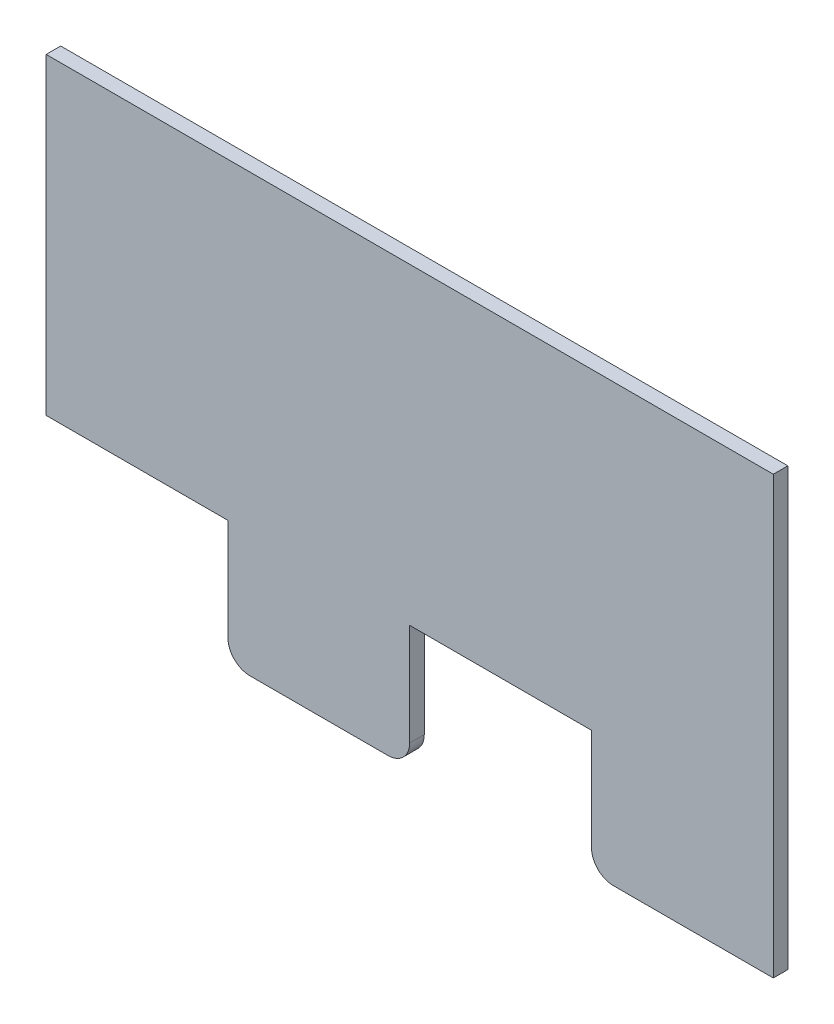
ISO-10303-21;
HEADER;
FILE_DESCRIPTION(('STEP AP214'),'2;1');
FILE_NAME('part.step','',(''),(''),'','','');
FILE_SCHEMA(('AUTOMOTIVE_DESIGN { 1 0 10303 214 1 1 1 1 }'));
ENDSEC;
DATA;
#1=APPLICATION_CONTEXT('core data for automotive mechanical design processes');
#2=APPLICATION_PROTOCOL_DEFINITION('international standard','automotive_design',2000,#1);
#3=PRODUCT_CONTEXT('',#1,'mechanical');
#4=PRODUCT('Part','Part','',(#3));
#5=PRODUCT_RELATED_PRODUCT_CATEGORY('part','',(#4));
#6=PRODUCT_DEFINITION_FORMATION('','',#4);
#7=PRODUCT_DEFINITION_CONTEXT('part definition',#1,'design');
#8=PRODUCT_DEFINITION('design','',#6,#7);
#9=PRODUCT_DEFINITION_SHAPE('','',#8);
#10=(LENGTH_UNIT() NAMED_UNIT(*) SI_UNIT(.MILLI.,.METRE.));
#11=(NAMED_UNIT(*) PLANE_ANGLE_UNIT() SI_UNIT($,.RADIAN.));
#12=(NAMED_UNIT(*) SI_UNIT($,.STERADIAN.) SOLID_ANGLE_UNIT());
#13=UNCERTAINTY_MEASURE_WITH_UNIT(LENGTH_MEASURE(1.E-05),#10,'distance_accuracy_value','');
#14=(GEOMETRIC_REPRESENTATION_CONTEXT(3) GLOBAL_UNCERTAINTY_ASSIGNED_CONTEXT((#13)) GLOBAL_UNIT_ASSIGNED_CONTEXT((#10,
#11,#12)) REPRESENTATION_CONTEXT('',''));
#15=CARTESIAN_POINT('',(0.,0.,0.));
#16=DIRECTION('',(0.,0.,1.));
#17=DIRECTION('',(1.,0.,0.));
#18=AXIS2_PLACEMENT_3D('',#15,#16,#17);
#19=CARTESIAN_POINT('',(28.,-17.,2.));
#20=DIRECTION('',(0.,0.,-1.));
#21=DIRECTION('',(-1.,0.,0.));
#22=AXIS2_PLACEMENT_3D('',#19,#20,#21);
#23=CYLINDRICAL_SURFACE('',#22,3.);
#24=CARTESIAN_POINT('',(28.,-17.,0.));
#25=DIRECTION('',(0.,0.,1.));
#26=DIRECTION('',(1.,0.,0.));
#27=AXIS2_PLACEMENT_3D('',#24,#25,#26);
#28=CIRCLE('',#27,3.);
#29=CARTESIAN_POINT('',(28.,-20.,0.));
#30=VERTEX_POINT('',#29);
#31=CARTESIAN_POINT('',(25.,-17.,0.));
#32=VERTEX_POINT('',#31);
#33=EDGE_CURVE('E160',#30,#32,#28,.F.);
#34=ORIENTED_EDGE('',*,*,#33,.F.);
#35=DIRECTION('',(0.,0.,-1.));
#36=VECTOR('',#35,1.);
#37=CARTESIAN_POINT('',(28.,-20.,2.));
#38=LINE('',#37,#36);
#39=CARTESIAN_POINT('',(28.,-20.,2.));
#40=VERTEX_POINT('',#39);
#41=EDGE_CURVE('E11',#40,#30,#38,.T.);
#42=ORIENTED_EDGE('',*,*,#41,.F.);
#43=CARTESIAN_POINT('',(28.,-17.,2.));
#44=DIRECTION('',(0.,0.,1.));
#45=DIRECTION('',(1.,0.,0.));
#46=AXIS2_PLACEMENT_3D('',#43,#44,#45);
#47=CIRCLE('',#46,3.);
#48=CARTESIAN_POINT('',(25.,-17.,2.));
#49=VERTEX_POINT('',#48);
#50=EDGE_CURVE('E190',#40,#49,#47,.F.);
#51=ORIENTED_EDGE('',*,*,#50,.T.);
#52=DIRECTION('',(0.,0.,-1.));
#53=VECTOR('',#52,1.);
#54=CARTESIAN_POINT('',(25.,-17.,2.));
#55=LINE('',#54,#53);
#56=EDGE_CURVE('E101',#49,#32,#55,.T.);
#57=ORIENTED_EDGE('',*,*,#56,.T.);
#58=EDGE_LOOP('',(#34,#42,#51,#57));
#59=FACE_BOUND('',#58,.T.);
#60=ADVANCED_FACE('F36',(#59),#23,.T.);
#61=CARTESIAN_POINT('',(0.,-20.,2.));
#62=DIRECTION('',(0.,1.,0.));
#63=DIRECTION('',(-1.,0.,0.));
#64=AXIS2_PLACEMENT_3D('',#61,#62,#63);
#65=PLANE('',#64);
#66=DIRECTION('',(1.,0.,0.));
#67=VECTOR('',#66,1.);
#68=CARTESIAN_POINT('',(0.,-20.,0.));
#69=LINE('',#68,#67);
#70=CARTESIAN_POINT('',(50.,-20.,0.));
#71=VERTEX_POINT('',#70);
#72=EDGE_CURVE('E163',#30,#71,#69,.T.);
#73=ORIENTED_EDGE('',*,*,#72,.T.);
#74=DIRECTION('',(0.,0.,-1.));
#75=VECTOR('',#74,1.);
#76=CARTESIAN_POINT('',(50.,-20.,2.));
#77=LINE('',#76,#75);
#78=CARTESIAN_POINT('',(50.,-20.,2.));
#79=VERTEX_POINT('',#78);
#80=EDGE_CURVE('E44',#79,#71,#77,.T.);
#81=ORIENTED_EDGE('',*,*,#80,.F.);
#82=DIRECTION('',(1.,0.,0.));
#83=VECTOR('',#82,1.);
#84=CARTESIAN_POINT('',(0.,-20.,2.));
#85=LINE('',#84,#83);
#86=EDGE_CURVE('E236',#40,#79,#85,.T.);
#87=ORIENTED_EDGE('',*,*,#86,.F.);
#88=ORIENTED_EDGE('',*,*,#41,.T.);
#89=EDGE_LOOP('',(#73,#81,#87,#88));
#90=FACE_BOUND('',#89,.T.);
#91=ADVANCED_FACE('F258',(#90),#65,.F.);
#92=CARTESIAN_POINT('',(50.,0.,2.));
#93=DIRECTION('',(-1.,0.,0.));
#94=DIRECTION('',(0.,0.,1.));
#95=AXIS2_PLACEMENT_3D('',#92,#93,#94);
#96=PLANE('',#95);
#97=DIRECTION('',(0.,1.,0.));
#98=VECTOR('',#97,1.);
#99=CARTESIAN_POINT('',(50.,0.,0.));
#100=LINE('',#99,#98);
#101=CARTESIAN_POINT('',(50.,40.,0.));
#102=VERTEX_POINT('',#101);
#103=EDGE_CURVE('E165',#71,#102,#100,.T.);
#104=ORIENTED_EDGE('',*,*,#103,.T.);
#105=DIRECTION('',(0.,0.,-1.));
#106=VECTOR('',#105,1.);
#107=CARTESIAN_POINT('',(50.,40.,2.));
#108=LINE('',#107,#106);
#109=CARTESIAN_POINT('',(50.,40.,2.));
#110=VERTEX_POINT('',#109);
#111=EDGE_CURVE('E209',#110,#102,#108,.T.);
#112=ORIENTED_EDGE('',*,*,#111,.F.);
#113=DIRECTION('',(0.,1.,0.));
#114=VECTOR('',#113,1.);
#115=CARTESIAN_POINT('',(50.,0.,2.));
#116=LINE('',#115,#114);
#117=EDGE_CURVE('E217',#79,#110,#116,.T.);
#118=ORIENTED_EDGE('',*,*,#117,.F.);
#119=ORIENTED_EDGE('',*,*,#80,.T.);
#120=EDGE_LOOP('',(#104,#112,#118,#119));
#121=FACE_BOUND('',#120,.T.);
#122=ADVANCED_FACE('F215',(#121),#96,.F.);
#123=CARTESIAN_POINT('',(0.,40.,2.));
#124=DIRECTION('',(0.,1.,0.));
#125=DIRECTION('',(0.,0.,1.));
#126=AXIS2_PLACEMENT_3D('',#123,#124,#125);
#127=PLANE('',#126);
#128=DIRECTION('',(1.,0.,0.));
#129=VECTOR('',#128,1.);
#130=CARTESIAN_POINT('',(0.,40.,0.));
#131=LINE('',#130,#129);
#132=CARTESIAN_POINT('',(-50.,40.,0.));
#133=VERTEX_POINT('',#132);
#134=EDGE_CURVE('E168',#133,#102,#131,.T.);
#135=ORIENTED_EDGE('',*,*,#134,.F.);
#136=DIRECTION('',(0.,0.,-1.));
#137=VECTOR('',#136,1.);
#138=CARTESIAN_POINT('',(-50.,40.,2.));
#139=LINE('',#138,#137);
#140=CARTESIAN_POINT('',(-50.,40.,2.));
#141=VERTEX_POINT('',#140);
#142=EDGE_CURVE('E207',#141,#133,#139,.T.);
#143=ORIENTED_EDGE('',*,*,#142,.F.);
#144=DIRECTION('',(1.,0.,0.));
#145=VECTOR('',#144,1.);
#146=CARTESIAN_POINT('',(0.,40.,2.));
#147=LINE('',#146,#145);
#148=EDGE_CURVE('E229',#141,#110,#147,.T.);
#149=ORIENTED_EDGE('',*,*,#148,.T.);
#150=ORIENTED_EDGE('',*,*,#111,.T.);
#151=EDGE_LOOP('',(#135,#143,#149,#150));
#152=FACE_BOUND('',#151,.T.);
#153=ADVANCED_FACE('F226',(#152),#127,.T.);
#154=CARTESIAN_POINT('',(-50.,0.,2.));
#155=DIRECTION('',(-1.,0.,0.));
#156=DIRECTION('',(0.,0.,1.));
#157=AXIS2_PLACEMENT_3D('',#154,#155,#156);
#158=PLANE('',#157);
#159=DIRECTION('',(0.,1.,0.));
#160=VECTOR('',#159,1.);
#161=CARTESIAN_POINT('',(-50.,0.,0.));
#162=LINE('',#161,#160);
#163=CARTESIAN_POINT('',(-50.,-3.,0.));
#164=VERTEX_POINT('',#163);
#165=EDGE_CURVE('E171',#164,#133,#162,.T.);
#166=ORIENTED_EDGE('',*,*,#165,.F.);
#167=DIRECTION('',(0.,0.,-1.));
#168=VECTOR('',#167,1.);
#169=CARTESIAN_POINT('',(-50.,-3.,2.));
#170=LINE('',#169,#168);
#171=CARTESIAN_POINT('',(-50.,-3.,2.));
#172=VERTEX_POINT('',#171);
#173=EDGE_CURVE('E205',#172,#164,#170,.T.);
#174=ORIENTED_EDGE('',*,*,#173,.F.);
#175=DIRECTION('',(0.,1.,0.));
#176=VECTOR('',#175,1.);
#177=CARTESIAN_POINT('',(-50.,0.,2.));
#178=LINE('',#177,#176);
#179=EDGE_CURVE('E232',#172,#141,#178,.T.);
#180=ORIENTED_EDGE('',*,*,#179,.T.);
#181=ORIENTED_EDGE('',*,*,#142,.T.);
#182=EDGE_LOOP('',(#166,#174,#180,#181));
#183=FACE_BOUND('',#182,.T.);
#184=ADVANCED_FACE('F268',(#183),#158,.T.);
#185=CARTESIAN_POINT('',(0.,-3.,2.));
#186=DIRECTION('',(0.,1.,0.));
#187=DIRECTION('',(0.,0.,1.));
#188=AXIS2_PLACEMENT_3D('',#185,#186,#187);
#189=PLANE('',#188);
#190=DIRECTION('',(1.,0.,0.));
#191=VECTOR('',#190,1.);
#192=CARTESIAN_POINT('',(0.,-3.,0.));
#193=LINE('',#192,#191);
#194=CARTESIAN_POINT('',(-25.,-3.,0.));
#195=VERTEX_POINT('',#194);
#196=EDGE_CURVE('E174',#164,#195,#193,.T.);
#197=ORIENTED_EDGE('',*,*,#196,.T.);
#198=DIRECTION('',(0.,0.,-1.));
#199=VECTOR('',#198,1.);
#200=CARTESIAN_POINT('',(-25.,-3.,2.));
#201=LINE('',#200,#199);
#202=CARTESIAN_POINT('',(-25.,-3.,2.));
#203=VERTEX_POINT('',#202);
#204=EDGE_CURVE('E202',#203,#195,#201,.T.);
#205=ORIENTED_EDGE('',*,*,#204,.F.);
#206=DIRECTION('',(1.,0.,0.));
#207=VECTOR('',#206,1.);
#208=CARTESIAN_POINT('',(0.,-3.,2.));
#209=LINE('',#208,#207);
#210=EDGE_CURVE('E234',#172,#203,#209,.T.);
#211=ORIENTED_EDGE('',*,*,#210,.F.);
#212=ORIENTED_EDGE('',*,*,#173,.T.);
#213=EDGE_LOOP('',(#197,#205,#211,#212));
#214=FACE_BOUND('',#213,.T.);
#215=ADVANCED_FACE('F271',(#214),#189,.F.);
#216=CARTESIAN_POINT('',(-25.,0.,2.));
#217=DIRECTION('',(1.,0.,0.));
#218=DIRECTION('',(0.,1.,0.));
#219=AXIS2_PLACEMENT_3D('',#216,#217,#218);
#220=PLANE('',#219);
#221=DIRECTION('',(0.,-1.,0.));
#222=VECTOR('',#221,1.);
#223=CARTESIAN_POINT('',(-25.,0.,0.));
#224=LINE('',#223,#222);
#225=CARTESIAN_POINT('',(-25.,-17.,0.));
#226=VERTEX_POINT('',#225);
#227=EDGE_CURVE('E176',#195,#226,#224,.T.);
#228=ORIENTED_EDGE('',*,*,#227,.T.);
#229=DIRECTION('',(0.,0.,-1.));
#230=VECTOR('',#229,1.);
#231=CARTESIAN_POINT('',(-25.,-17.,2.));
#232=LINE('',#231,#230);
#233=CARTESIAN_POINT('',(-25.,-17.,2.));
#234=VERTEX_POINT('',#233);
#235=EDGE_CURVE('E199',#234,#226,#232,.T.);
#236=ORIENTED_EDGE('',*,*,#235,.F.);
#237=DIRECTION('',(0.,-1.,0.));
#238=VECTOR('',#237,1.);
#239=CARTESIAN_POINT('',(-25.,0.,2.));
#240=LINE('',#239,#238);
#241=EDGE_CURVE('E241',#203,#234,#240,.T.);
#242=ORIENTED_EDGE('',*,*,#241,.F.);
#243=ORIENTED_EDGE('',*,*,#204,.T.);
#244=EDGE_LOOP('',(#228,#236,#242,#243));
#245=FACE_BOUND('',#244,.T.);
#246=ADVANCED_FACE('F275',(#245),#220,.F.);
#247=CARTESIAN_POINT('',(-22.,-17.,2.));
#248=DIRECTION('',(0.,0.,-1.));
#249=DIRECTION('',(-1.,0.,0.));
#250=AXIS2_PLACEMENT_3D('',#247,#248,#249);
#251=CYLINDRICAL_SURFACE('',#250,3.);
#252=CARTESIAN_POINT('',(-22.,-17.,0.));
#253=DIRECTION('',(0.,0.,1.));
#254=DIRECTION('',(1.,0.,0.));
#255=AXIS2_PLACEMENT_3D('',#252,#253,#254);
#256=CIRCLE('',#255,3.);
#257=CARTESIAN_POINT('',(-22.,-20.,0.));
#258=VERTEX_POINT('',#257);
#259=EDGE_CURVE('E178',#226,#258,#256,.T.);
#260=ORIENTED_EDGE('',*,*,#259,.T.);
#261=DIRECTION('',(0.,0.,-1.));
#262=VECTOR('',#261,1.);
#263=CARTESIAN_POINT('',(-22.,-20.,2.));
#264=LINE('',#263,#262);
#265=CARTESIAN_POINT('',(-22.,-20.,2.));
#266=VERTEX_POINT('',#265);
#267=EDGE_CURVE('E196',#266,#258,#264,.T.);
#268=ORIENTED_EDGE('',*,*,#267,.F.);
#269=CARTESIAN_POINT('',(-22.,-17.,2.));
#270=DIRECTION('',(0.,0.,1.));
#271=DIRECTION('',(1.,0.,0.));
#272=AXIS2_PLACEMENT_3D('',#269,#270,#271);
#273=CIRCLE('',#272,3.);
#274=EDGE_CURVE('E243',#234,#266,#273,.T.);
#275=ORIENTED_EDGE('',*,*,#274,.F.);
#276=ORIENTED_EDGE('',*,*,#235,.T.);
#277=EDGE_LOOP('',(#260,#268,#275,#276));
#278=FACE_BOUND('',#277,.T.);
#279=ADVANCED_FACE('F279',(#278),#251,.T.);
#280=CARTESIAN_POINT('',(0.,-20.,2.));
#281=DIRECTION('',(0.,1.,0.));
#282=DIRECTION('',(0.,0.,1.));
#283=AXIS2_PLACEMENT_3D('',#280,#281,#282);
#284=PLANE('',#283);
#285=DIRECTION('',(1.,0.,0.));
#286=VECTOR('',#285,1.);
#287=CARTESIAN_POINT('',(0.,-20.,0.));
#288=LINE('',#287,#286);
#289=CARTESIAN_POINT('',(-3.00000000000001,-20.,0.));
#290=VERTEX_POINT('',#289);
#291=EDGE_CURVE('E180',#258,#290,#288,.T.);
#292=ORIENTED_EDGE('',*,*,#291,.T.);
#293=DIRECTION('',(0.,0.,-1.));
#294=VECTOR('',#293,1.);
#295=CARTESIAN_POINT('',(-3.00000000000001,-20.,2.));
#296=LINE('',#295,#294);
#297=CARTESIAN_POINT('',(-3.00000000000001,-20.,2.));
#298=VERTEX_POINT('',#297);
#299=EDGE_CURVE('E194',#298,#290,#296,.T.);
#300=ORIENTED_EDGE('',*,*,#299,.F.);
#301=DIRECTION('',(1.,0.,0.));
#302=VECTOR('',#301,1.);
#303=CARTESIAN_POINT('',(0.,-20.,2.));
#304=LINE('',#303,#302);
#305=EDGE_CURVE('E155',#266,#298,#304,.T.);
#306=ORIENTED_EDGE('',*,*,#305,.F.);
#307=ORIENTED_EDGE('',*,*,#267,.T.);
#308=EDGE_LOOP('',(#292,#300,#306,#307));
#309=FACE_BOUND('',#308,.T.);
#310=ADVANCED_FACE('F249',(#309),#284,.F.);
#311=CARTESIAN_POINT('',(-2.99999999999999,-17.,2.));
#312=DIRECTION('',(0.,0.,-1.));
#313=DIRECTION('',(-1.,0.,0.));
#314=AXIS2_PLACEMENT_3D('',#311,#312,#313);
#315=CYLINDRICAL_SURFACE('',#314,3.);
#316=CARTESIAN_POINT('',(-2.99999999999999,-17.,0.));
#317=DIRECTION('',(0.,0.,1.));
#318=DIRECTION('',(1.,0.,0.));
#319=AXIS2_PLACEMENT_3D('',#316,#317,#318);
#320=CIRCLE('',#319,3.);
#321=CARTESIAN_POINT('',(0.,-17.,0.));
#322=VERTEX_POINT('',#321);
#323=EDGE_CURVE('E183',#322,#290,#320,.F.);
#324=ORIENTED_EDGE('',*,*,#323,.F.);
#325=DIRECTION('',(0.,0.,-1.));
#326=VECTOR('',#325,1.);
#327=CARTESIAN_POINT('',(0.,-17.,2.));
#328=LINE('',#327,#326);
#329=CARTESIAN_POINT('',(0.,-17.,2.));
#330=VERTEX_POINT('',#329);
#331=EDGE_CURVE('E144',#330,#322,#328,.T.);
#332=ORIENTED_EDGE('',*,*,#331,.F.);
#333=CARTESIAN_POINT('',(-2.99999999999999,-17.,2.));
#334=DIRECTION('',(0.,0.,1.));
#335=DIRECTION('',(1.,0.,0.));
#336=AXIS2_PLACEMENT_3D('',#333,#334,#335);
#337=CIRCLE('',#336,3.);
#338=EDGE_CURVE('E153',#330,#298,#337,.F.);
#339=ORIENTED_EDGE('',*,*,#338,.T.);
#340=ORIENTED_EDGE('',*,*,#299,.T.);
#341=EDGE_LOOP('',(#324,#332,#339,#340));
#342=FACE_BOUND('',#341,.T.);
#343=ADVANCED_FACE('F253',(#342),#315,.T.);
#344=CARTESIAN_POINT('',(0.,0.,2.));
#345=DIRECTION('',(1.,0.,0.));
#346=DIRECTION('',(0.,0.,-1.));
#347=AXIS2_PLACEMENT_3D('',#344,#345,#346);
#348=PLANE('',#347);
#349=DIRECTION('',(0.,-1.,0.));
#350=VECTOR('',#349,1.);
#351=CARTESIAN_POINT('',(0.,0.,0.));
#352=LINE('',#351,#350);
#353=CARTESIAN_POINT('',(0.,-3.,0.));
#354=VERTEX_POINT('',#353);
#355=EDGE_CURVE('E143',#354,#322,#352,.T.);
#356=ORIENTED_EDGE('',*,*,#355,.F.);
#357=DIRECTION('',(0.,0.,-1.));
#358=VECTOR('',#357,1.);
#359=CARTESIAN_POINT('',(0.,-3.,2.));
#360=LINE('',#359,#358);
#361=CARTESIAN_POINT('',(0.,-3.,2.));
#362=VERTEX_POINT('',#361);
#363=EDGE_CURVE('E137',#362,#354,#360,.T.);
#364=ORIENTED_EDGE('',*,*,#363,.F.);
#365=DIRECTION('',(0.,-1.,0.));
#366=VECTOR('',#365,1.);
#367=CARTESIAN_POINT('',(0.,0.,2.));
#368=LINE('',#367,#366);
#369=EDGE_CURVE('E141',#362,#330,#368,.T.);
#370=ORIENTED_EDGE('',*,*,#369,.T.);
#371=ORIENTED_EDGE('',*,*,#331,.T.);
#372=EDGE_LOOP('',(#356,#364,#370,#371));
#373=FACE_BOUND('',#372,.T.);
#374=ADVANCED_FACE('F139',(#373),#348,.T.);
#375=CARTESIAN_POINT('',(0.,-3.,2.));
#376=DIRECTION('',(0.,1.,0.));
#377=DIRECTION('',(0.,0.,1.));
#378=AXIS2_PLACEMENT_3D('',#375,#376,#377);
#379=PLANE('',#378);
#380=DIRECTION('',(1.,0.,0.));
#381=VECTOR('',#380,1.);
#382=CARTESIAN_POINT('',(0.,-3.,0.));
#383=LINE('',#382,#381);
#384=CARTESIAN_POINT('',(25.,-3.,0.));
#385=VERTEX_POINT('',#384);
#386=EDGE_CURVE('E94',#354,#385,#383,.T.);
#387=ORIENTED_EDGE('',*,*,#386,.T.);
#388=DIRECTION('',(0.,0.,-1.));
#389=VECTOR('',#388,1.);
#390=CARTESIAN_POINT('',(25.,-3.,2.));
#391=LINE('',#390,#389);
#392=CARTESIAN_POINT('',(25.,-3.,2.));
#393=VERTEX_POINT('',#392);
#394=EDGE_CURVE('E145',#393,#385,#391,.T.);
#395=ORIENTED_EDGE('',*,*,#394,.F.);
#396=DIRECTION('',(1.,0.,0.));
#397=VECTOR('',#396,1.);
#398=CARTESIAN_POINT('',(0.,-3.,2.));
#399=LINE('',#398,#397);
#400=EDGE_CURVE('E147',#362,#393,#399,.T.);
#401=ORIENTED_EDGE('',*,*,#400,.F.);
#402=ORIENTED_EDGE('',*,*,#363,.T.);
#403=EDGE_LOOP('',(#387,#395,#401,#402));
#404=FACE_BOUND('',#403,.T.);
#405=ADVANCED_FACE('F148',(#404),#379,.F.);
#406=CARTESIAN_POINT('',(25.,0.,2.));
#407=DIRECTION('',(1.,0.,0.));
#408=DIRECTION('',(0.,0.,-1.));
#409=AXIS2_PLACEMENT_3D('',#406,#407,#408);
#410=PLANE('',#409);
#411=DIRECTION('',(0.,-1.,0.));
#412=VECTOR('',#411,1.);
#413=CARTESIAN_POINT('',(25.,0.,0.));
#414=LINE('',#413,#412);
#415=EDGE_CURVE('E188',#385,#32,#414,.T.);
#416=ORIENTED_EDGE('',*,*,#415,.T.);
#417=ORIENTED_EDGE('',*,*,#56,.F.);
#418=DIRECTION('',(0.,-1.,0.));
#419=VECTOR('',#418,1.);
#420=CARTESIAN_POINT('',(25.,0.,2.));
#421=LINE('',#420,#419);
#422=EDGE_CURVE('E52',#393,#49,#421,.T.);
#423=ORIENTED_EDGE('',*,*,#422,.F.);
#424=ORIENTED_EDGE('',*,*,#394,.T.);
#425=EDGE_LOOP('',(#416,#417,#423,#424));
#426=FACE_BOUND('',#425,.T.);
#427=ADVANCED_FACE('F256',(#426),#410,.F.);
#428=CARTESIAN_POINT('',(0.,0.,2.));
#429=DIRECTION('',(0.,0.,1.));
#430=DIRECTION('',(1.,0.,0.));
#431=AXIS2_PLACEMENT_3D('',#428,#429,#430);
#432=PLANE('',#431);
#433=ORIENTED_EDGE('',*,*,#50,.F.);
#434=ORIENTED_EDGE('',*,*,#86,.T.);
#435=ORIENTED_EDGE('',*,*,#117,.T.);
#436=ORIENTED_EDGE('',*,*,#148,.F.);
#437=ORIENTED_EDGE('',*,*,#179,.F.);
#438=ORIENTED_EDGE('',*,*,#210,.T.);
#439=ORIENTED_EDGE('',*,*,#241,.T.);
#440=ORIENTED_EDGE('',*,*,#274,.T.);
#441=ORIENTED_EDGE('',*,*,#305,.T.);
#442=ORIENTED_EDGE('',*,*,#338,.F.);
#443=ORIENTED_EDGE('',*,*,#369,.F.);
#444=ORIENTED_EDGE('',*,*,#400,.T.);
#445=ORIENTED_EDGE('',*,*,#422,.T.);
#446=EDGE_LOOP('',(#433,#434,#435,#436,#437,#438,#439,#440,#441,#442,#443,#444,#445));
#447=FACE_BOUND('',#446,.T.);
#448=ADVANCED_FACE('F151',(#447),#432,.T.);
#449=CARTESIAN_POINT('',(0.,0.,0.));
#450=DIRECTION('',(0.,0.,1.));
#451=DIRECTION('',(1.,0.,0.));
#452=AXIS2_PLACEMENT_3D('',#449,#450,#451);
#453=PLANE('',#452);
#454=ORIENTED_EDGE('',*,*,#33,.T.);
#455=ORIENTED_EDGE('',*,*,#415,.F.);
#456=ORIENTED_EDGE('',*,*,#386,.F.);
#457=ORIENTED_EDGE('',*,*,#355,.T.);
#458=ORIENTED_EDGE('',*,*,#323,.T.);
#459=ORIENTED_EDGE('',*,*,#291,.F.);
#460=ORIENTED_EDGE('',*,*,#259,.F.);
#461=ORIENTED_EDGE('',*,*,#227,.F.);
#462=ORIENTED_EDGE('',*,*,#196,.F.);
#463=ORIENTED_EDGE('',*,*,#165,.T.);
#464=ORIENTED_EDGE('',*,*,#134,.T.);
#465=ORIENTED_EDGE('',*,*,#103,.F.);
#466=ORIENTED_EDGE('',*,*,#72,.F.);
#467=EDGE_LOOP('',(#454,#455,#456,#457,#458,#459,#460,#461,#462,#463,#464,#465,#466));
#468=FACE_BOUND('',#467,.T.);
#469=ADVANCED_FACE('F221',(#468),#453,.F.);
#470=CLOSED_SHELL('',(#60,#91,#122,#153,#184,#215,#246,#279,#310,#343,#374,#405,#427,#448,#469));
#471=MANIFOLD_SOLID_BREP('B2',#470);
#472=ADVANCED_BREP_SHAPE_REPRESENTATION('',(#18,#471),#14);
#473=SHAPE_DEFINITION_REPRESENTATION(#9,#472);
ENDSEC;
END-ISO-10303-21;
